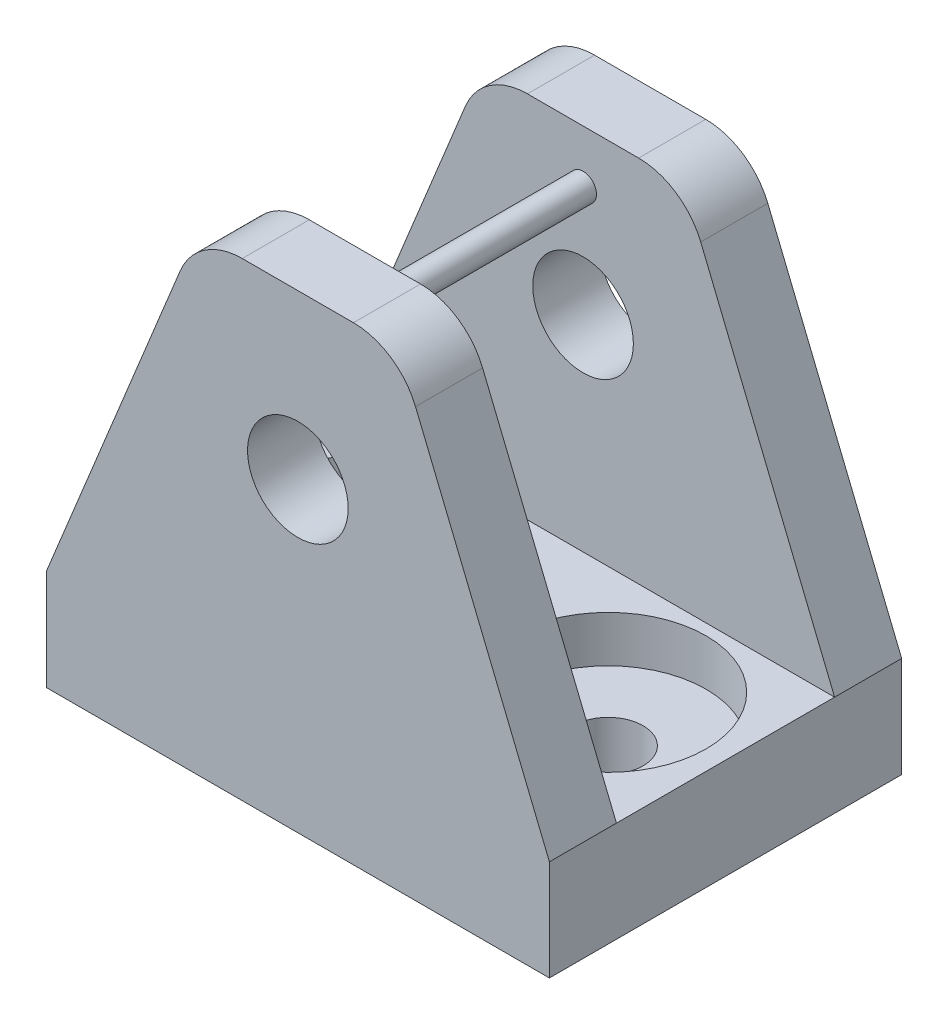
ISO-10303-21;
HEADER;
FILE_DESCRIPTION(('STEP AP214'),'2;1');
FILE_NAME('part.step','',(''),(''),'','','');
FILE_SCHEMA(('AUTOMOTIVE_DESIGN { 1 0 10303 214 1 1 1 1 }'));
ENDSEC;
DATA;
#1=APPLICATION_CONTEXT('core data for automotive mechanical design processes');
#2=APPLICATION_PROTOCOL_DEFINITION('international standard','automotive_design',2000,#1);
#3=PRODUCT_CONTEXT('',#1,'mechanical');
#4=PRODUCT('Part','Part','',(#3));
#5=PRODUCT_RELATED_PRODUCT_CATEGORY('part','',(#4));
#6=PRODUCT_DEFINITION_FORMATION('','',#4);
#7=PRODUCT_DEFINITION_CONTEXT('part definition',#1,'design');
#8=PRODUCT_DEFINITION('design','',#6,#7);
#9=PRODUCT_DEFINITION_SHAPE('','',#8);
#10=(LENGTH_UNIT() NAMED_UNIT(*) SI_UNIT(.MILLI.,.METRE.));
#11=(NAMED_UNIT(*) PLANE_ANGLE_UNIT() SI_UNIT($,.RADIAN.));
#12=(NAMED_UNIT(*) SI_UNIT($,.STERADIAN.) SOLID_ANGLE_UNIT());
#13=UNCERTAINTY_MEASURE_WITH_UNIT(LENGTH_MEASURE(1.E-05),#10,'distance_accuracy_value','');
#14=(GEOMETRIC_REPRESENTATION_CONTEXT(3) GLOBAL_UNCERTAINTY_ASSIGNED_CONTEXT((#13)) GLOBAL_UNIT_ASSIGNED_CONTEXT((#10,
#11,#12)) REPRESENTATION_CONTEXT('',''));
#15=CARTESIAN_POINT('',(0.,0.,0.));
#16=DIRECTION('',(0.,0.,1.));
#17=DIRECTION('',(1.,0.,0.));
#18=AXIS2_PLACEMENT_3D('',#15,#16,#17);
#19=CARTESIAN_POINT('',(0.,44.45,0.));
#20=DIRECTION('',(0.,-1.,0.));
#21=DIRECTION('',(0.,0.,-1.));
#22=AXIS2_PLACEMENT_3D('',#19,#20,#21);
#23=PLANE('',#22);
#24=DIRECTION('',(-1.,0.,0.));
#25=VECTOR('',#24,1.);
#26=CARTESIAN_POINT('',(-23.8125,44.45,-10.3251));
#27=LINE('',#26,#25);
#28=CARTESIAN_POINT('',(5.26191923114274,44.45,-10.3251));
#29=VERTEX_POINT('',#28);
#30=CARTESIAN_POINT('',(-5.26191923114273,44.45,-10.3251));
#31=VERTEX_POINT('',#30);
#32=EDGE_CURVE('E257',#29,#31,#27,.T.);
#33=ORIENTED_EDGE('',*,*,#32,.F.);
#34=DIRECTION('',(0.,0.,-1.));
#35=VECTOR('',#34,1.);
#36=CARTESIAN_POINT('',(5.26191923114274,44.45,0.));
#37=LINE('',#36,#35);
#38=CARTESIAN_POINT('',(5.26191923114274,44.45,-16.6751));
#39=VERTEX_POINT('',#38);
#40=EDGE_CURVE('E248',#29,#39,#37,.T.);
#41=ORIENTED_EDGE('',*,*,#40,.T.);
#42=DIRECTION('',(-1.,0.,0.));
#43=VECTOR('',#42,1.);
#44=CARTESIAN_POINT('',(-23.8125,44.45,-16.6751));
#45=LINE('',#44,#43);
#46=CARTESIAN_POINT('',(-5.26191923114273,44.45,-16.6751));
#47=VERTEX_POINT('',#46);
#48=EDGE_CURVE('E298',#39,#47,#45,.T.);
#49=ORIENTED_EDGE('',*,*,#48,.T.);
#50=DIRECTION('',(0.,0.,-1.));
#51=VECTOR('',#50,1.);
#52=CARTESIAN_POINT('',(-5.26191923114273,44.45,-10.3251));
#53=LINE('',#52,#51);
#54=EDGE_CURVE('E245',#47,#31,#53,.F.);
#55=ORIENTED_EDGE('',*,*,#54,.T.);
#56=EDGE_LOOP('',(#33,#41,#49,#55));
#57=FACE_BOUND('',#56,.T.);
#58=ADVANCED_FACE('F50',(#57),#23,.F.);
#59=CARTESIAN_POINT('',(-23.8125,44.45,-16.6751));
#60=DIRECTION('',(0.,0.,1.));
#61=DIRECTION('',(1.,0.,0.));
#62=AXIS2_PLACEMENT_3D('',#59,#60,#61);
#63=PLANE('',#62);
#64=CARTESIAN_POINT('',(0.,28.9694674268048,-16.6751));
#65=DIRECTION('',(0.,0.,1.));
#66=DIRECTION('',(1.,0.,0.));
#67=AXIS2_PLACEMENT_3D('',#64,#65,#66);
#68=CIRCLE('',#67,4.76249999999999);
#69=CARTESIAN_POINT('',(4.76249999999999,28.9694674268048,-16.6751));
#70=VERTEX_POINT('',#69);
#71=EDGE_CURVE('E749',#70,#70,#68,.T.);
#72=ORIENTED_EDGE('',*,*,#71,.T.);
#73=EDGE_LOOP('',(#72));
#74=FACE_BOUND('',#73,.T.);
#75=ORIENTED_EDGE('',*,*,#48,.F.);
#76=CARTESIAN_POINT('',(5.26191923114274,38.1,-16.6751));
#77=DIRECTION('',(0.,0.,1.));
#78=DIRECTION('',(1.,0.,0.));
#79=AXIS2_PLACEMENT_3D('',#76,#77,#78);
#80=CIRCLE('',#79,6.35);
#81=CARTESIAN_POINT('',(11.1391424030488,40.5043185703252,-16.6751));
#82=VERTEX_POINT('',#81);
#83=EDGE_CURVE('E376',#39,#82,#80,.F.);
#84=ORIENTED_EDGE('',*,*,#83,.T.);
#85=DIRECTION('',(0.378632845720504,-0.925546956205677,0.));
#86=VECTOR('',#85,1.);
#87=CARTESIAN_POINT('',(4.74564159292036,56.1328761061947,-16.6751));
#88=LINE('',#87,#86);
#89=CARTESIAN_POINT('',(23.8125,9.525,-16.6751));
#90=VERTEX_POINT('',#89);
#91=EDGE_CURVE('E259',#82,#90,#88,.T.);
#92=ORIENTED_EDGE('',*,*,#91,.T.);
#93=DIRECTION('',(0.,-1.,0.));
#94=VECTOR('',#93,1.);
#95=CARTESIAN_POINT('',(23.8125,44.45,-16.6751));
#96=LINE('',#95,#94);
#97=CARTESIAN_POINT('',(23.8125,0.,-16.6751));
#98=VERTEX_POINT('',#97);
#99=EDGE_CURVE('E194',#90,#98,#96,.T.);
#100=ORIENTED_EDGE('',*,*,#99,.T.);
#101=DIRECTION('',(-1.,0.,0.));
#102=VECTOR('',#101,1.);
#103=CARTESIAN_POINT('',(-23.8125,0.,-16.6751));
#104=LINE('',#103,#102);
#105=CARTESIAN_POINT('',(-23.8125,0.,-16.6751));
#106=VERTEX_POINT('',#105);
#107=EDGE_CURVE('E341',#98,#106,#104,.T.);
#108=ORIENTED_EDGE('',*,*,#107,.T.);
#109=DIRECTION('',(0.,-1.,0.));
#110=VECTOR('',#109,1.);
#111=CARTESIAN_POINT('',(-23.8125,44.45,-16.6751));
#112=LINE('',#111,#110);
#113=CARTESIAN_POINT('',(-23.8125,9.525,-16.6751));
#114=VERTEX_POINT('',#113);
#115=EDGE_CURVE('E189',#114,#106,#112,.T.);
#116=ORIENTED_EDGE('',*,*,#115,.F.);
#117=DIRECTION('',(-0.378632845720504,-0.925546956205677,0.));
#118=VECTOR('',#117,1.);
#119=CARTESIAN_POINT('',(-11.573296460177,39.4430530973451,-16.6751));
#120=LINE('',#119,#118);
#121=CARTESIAN_POINT('',(-11.1391424030488,40.5043185703252,-16.6751));
#122=VERTEX_POINT('',#121);
#123=EDGE_CURVE('E253',#122,#114,#120,.T.);
#124=ORIENTED_EDGE('',*,*,#123,.F.);
#125=CARTESIAN_POINT('',(-5.26191923114273,38.1,-16.6751));
#126=DIRECTION('',(0.,0.,1.));
#127=DIRECTION('',(1.,0.,0.));
#128=AXIS2_PLACEMENT_3D('',#125,#126,#127);
#129=CIRCLE('',#128,6.35);
#130=EDGE_CURVE('E252',#122,#47,#129,.F.);
#131=ORIENTED_EDGE('',*,*,#130,.T.);
#132=EDGE_LOOP('',(#75,#84,#92,#100,#108,#116,#124,#131));
#133=FACE_BOUND('',#132,.T.);
#134=ADVANCED_FACE('F339',(#74,#133),#63,.F.);
#135=CARTESIAN_POINT('',(-23.8125,44.45,16.6751));
#136=DIRECTION('',(1.,0.,0.));
#137=DIRECTION('',(0.,0.,-1.));
#138=AXIS2_PLACEMENT_3D('',#135,#136,#137);
#139=PLANE('',#138);
#140=DIRECTION('',(0.,0.,-1.));
#141=VECTOR('',#140,1.);
#142=CARTESIAN_POINT('',(-23.8125,9.525,16.6751));
#143=LINE('',#142,#141);
#144=CARTESIAN_POINT('',(-23.8125,9.525,-10.3251));
#145=VERTEX_POINT('',#144);
#146=EDGE_CURVE('E169',#145,#114,#143,.T.);
#147=ORIENTED_EDGE('',*,*,#146,.T.);
#148=ORIENTED_EDGE('',*,*,#115,.T.);
#149=DIRECTION('',(0.,0.,1.));
#150=VECTOR('',#149,1.);
#151=CARTESIAN_POINT('',(-23.8125,0.,16.6751));
#152=LINE('',#151,#150);
#153=CARTESIAN_POINT('',(-23.8125,0.,16.6751));
#154=VERTEX_POINT('',#153);
#155=EDGE_CURVE('E186',#106,#154,#152,.T.);
#156=ORIENTED_EDGE('',*,*,#155,.T.);
#157=DIRECTION('',(0.,-1.,0.));
#158=VECTOR('',#157,1.);
#159=CARTESIAN_POINT('',(-23.8125,44.45,16.6751));
#160=LINE('',#159,#158);
#161=CARTESIAN_POINT('',(-23.8125,9.525,16.6751));
#162=VERTEX_POINT('',#161);
#163=EDGE_CURVE('E175',#162,#154,#160,.T.);
#164=ORIENTED_EDGE('',*,*,#163,.F.);
#165=CARTESIAN_POINT('',(-23.8125,9.525,10.3251));
#166=VERTEX_POINT('',#165);
#167=EDGE_CURVE('E155',#162,#166,#143,.T.);
#168=ORIENTED_EDGE('',*,*,#167,.T.);
#169=DIRECTION('',(0.,0.,1.));
#170=VECTOR('',#169,1.);
#171=CARTESIAN_POINT('',(-23.8125,9.525,10.3251));
#172=LINE('',#171,#170);
#173=EDGE_CURVE('E293',#145,#166,#172,.T.);
#174=ORIENTED_EDGE('',*,*,#173,.F.);
#175=EDGE_LOOP('',(#147,#148,#156,#164,#168,#174));
#176=FACE_BOUND('',#175,.T.);
#177=ADVANCED_FACE('F184',(#176),#139,.F.);
#178=CARTESIAN_POINT('',(-23.8125,44.45,16.6751));
#179=DIRECTION('',(0.,0.,-1.));
#180=DIRECTION('',(-1.,0.,0.));
#181=AXIS2_PLACEMENT_3D('',#178,#179,#180);
#182=PLANE('',#181);
#183=CARTESIAN_POINT('',(0.,28.9694674268048,16.6751));
#184=DIRECTION('',(0.,0.,1.));
#185=DIRECTION('',(1.,0.,0.));
#186=AXIS2_PLACEMENT_3D('',#183,#184,#185);
#187=CIRCLE('',#186,4.76249999999999);
#188=CARTESIAN_POINT('',(4.76249999999999,28.9694674268048,16.6751));
#189=VERTEX_POINT('',#188);
#190=EDGE_CURVE('E757',#189,#189,#187,.T.);
#191=ORIENTED_EDGE('',*,*,#190,.F.);
#192=EDGE_LOOP('',(#191));
#193=FACE_BOUND('',#192,.T.);
#194=DIRECTION('',(-0.378632845720504,0.925546956205677,0.));
#195=VECTOR('',#194,1.);
#196=CARTESIAN_POINT('',(23.7366371681416,9.71044247787611,16.6751));
#197=LINE('',#196,#195);
#198=CARTESIAN_POINT('',(23.8125,9.525,16.6751));
#199=VERTEX_POINT('',#198);
#200=CARTESIAN_POINT('',(11.1391424030488,40.5043185703252,16.6751));
#201=VERTEX_POINT('',#200);
#202=EDGE_CURVE('E213',#199,#201,#197,.T.);
#203=ORIENTED_EDGE('',*,*,#202,.T.);
#204=CARTESIAN_POINT('',(5.26191923114274,38.1,16.6751));
#205=DIRECTION('',(0.,0.,-1.));
#206=DIRECTION('',(-1.,0.,0.));
#207=AXIS2_PLACEMENT_3D('',#204,#205,#206);
#208=CIRCLE('',#207,6.35);
#209=CARTESIAN_POINT('',(5.26191923114274,44.45,16.6751));
#210=VERTEX_POINT('',#209);
#211=EDGE_CURVE('E239',#201,#210,#208,.F.);
#212=ORIENTED_EDGE('',*,*,#211,.T.);
#213=DIRECTION('',(1.,0.,0.));
#214=VECTOR('',#213,1.);
#215=CARTESIAN_POINT('',(-23.8125,44.45,16.6751));
#216=LINE('',#215,#214);
#217=CARTESIAN_POINT('',(-5.26191923114273,44.45,16.6751));
#218=VERTEX_POINT('',#217);
#219=EDGE_CURVE('E196',#218,#210,#216,.T.);
#220=ORIENTED_EDGE('',*,*,#219,.F.);
#221=CARTESIAN_POINT('',(-5.26191923114273,38.1,16.6751));
#222=DIRECTION('',(0.,0.,-1.));
#223=DIRECTION('',(-1.,0.,0.));
#224=AXIS2_PLACEMENT_3D('',#221,#222,#223);
#225=CIRCLE('',#224,6.35);
#226=CARTESIAN_POINT('',(-11.1391424030488,40.5043185703252,16.6751));
#227=VERTEX_POINT('',#226);
#228=EDGE_CURVE('E179',#218,#227,#225,.F.);
#229=ORIENTED_EDGE('',*,*,#228,.T.);
#230=DIRECTION('',(0.378632845720504,0.925546956205677,0.));
#231=VECTOR('',#230,1.);
#232=CARTESIAN_POINT('',(-23.7366371681416,9.71044247787611,16.6751));
#233=LINE('',#232,#231);
#234=EDGE_CURVE('E159',#162,#227,#233,.T.);
#235=ORIENTED_EDGE('',*,*,#234,.F.);
#236=ORIENTED_EDGE('',*,*,#163,.T.);
#237=DIRECTION('',(1.,0.,0.));
#238=VECTOR('',#237,1.);
#239=CARTESIAN_POINT('',(-23.8125,0.,16.6751));
#240=LINE('',#239,#238);
#241=CARTESIAN_POINT('',(23.8125,0.,16.6751));
#242=VERTEX_POINT('',#241);
#243=EDGE_CURVE('E348',#154,#242,#240,.T.);
#244=ORIENTED_EDGE('',*,*,#243,.T.);
#245=DIRECTION('',(0.,-1.,0.));
#246=VECTOR('',#245,1.);
#247=CARTESIAN_POINT('',(23.8125,44.45,16.6751));
#248=LINE('',#247,#246);
#249=EDGE_CURVE('E190',#199,#242,#248,.T.);
#250=ORIENTED_EDGE('',*,*,#249,.F.);
#251=EDGE_LOOP('',(#203,#212,#220,#229,#235,#236,#244,#250));
#252=FACE_BOUND('',#251,.T.);
#253=ADVANCED_FACE('F173',(#193,#252),#182,.F.);
#254=ORIENTED_EDGE('',*,*,#219,.T.);
#255=DIRECTION('',(0.,0.,-1.));
#256=VECTOR('',#255,1.);
#257=CARTESIAN_POINT('',(5.26191923114274,44.45,0.));
#258=LINE('',#257,#256);
#259=CARTESIAN_POINT('',(5.26191923114274,44.45,10.3251));
#260=VERTEX_POINT('',#259);
#261=EDGE_CURVE('E224',#210,#260,#258,.T.);
#262=ORIENTED_EDGE('',*,*,#261,.T.);
#263=DIRECTION('',(1.,0.,0.));
#264=VECTOR('',#263,1.);
#265=CARTESIAN_POINT('',(-23.8125,44.45,10.3251));
#266=LINE('',#265,#264);
#267=CARTESIAN_POINT('',(-5.26191923114273,44.45,10.3251));
#268=VERTEX_POINT('',#267);
#269=EDGE_CURVE('E267',#268,#260,#266,.T.);
#270=ORIENTED_EDGE('',*,*,#269,.F.);
#271=DIRECTION('',(0.,0.,-1.));
#272=VECTOR('',#271,1.);
#273=CARTESIAN_POINT('',(-5.26191923114273,44.45,16.6751));
#274=LINE('',#273,#272);
#275=EDGE_CURVE('E221',#268,#218,#274,.F.);
#276=ORIENTED_EDGE('',*,*,#275,.T.);
#277=EDGE_LOOP('',(#254,#262,#270,#276));
#278=FACE_BOUND('',#277,.T.);
#279=ADVANCED_FACE('F361',(#278),#23,.F.);
#280=CARTESIAN_POINT('',(-23.8125,-51.9092610719899,-10.3251));
#281=DIRECTION('',(0.,0.,-1.));
#282=DIRECTION('',(-1.,0.,0.));
#283=AXIS2_PLACEMENT_3D('',#280,#281,#282);
#284=PLANE('',#283);
#285=CARTESIAN_POINT('',(0.,39.4682751568496,-10.3251));
#286=DIRECTION('',(0.,0.,-1.));
#287=DIRECTION('',(-1.,0.,0.));
#288=AXIS2_PLACEMENT_3D('',#285,#286,#287);
#289=CIRCLE('',#288,1.27);
#290=CARTESIAN_POINT('',(-1.27,39.4682751568496,-10.3251));
#291=VERTEX_POINT('',#290);
#292=EDGE_CURVE('E13',#291,#291,#289,.F.);
#293=ORIENTED_EDGE('',*,*,#292,.F.);
#294=EDGE_LOOP('',(#293));
#295=FACE_BOUND('',#294,.T.);
#296=CARTESIAN_POINT('',(0.,28.9694674268048,-10.3251));
#297=DIRECTION('',(0.,0.,-1.));
#298=DIRECTION('',(-1.,0.,0.));
#299=AXIS2_PLACEMENT_3D('',#296,#297,#298);
#300=CIRCLE('',#299,4.76249999999999);
#301=CARTESIAN_POINT('',(-4.76249999999999,28.9694674268048,-10.3251));
#302=VERTEX_POINT('',#301);
#303=EDGE_CURVE('E747',#302,#302,#300,.T.);
#304=ORIENTED_EDGE('',*,*,#303,.T.);
#305=EDGE_LOOP('',(#304));
#306=FACE_BOUND('',#305,.T.);
#307=DIRECTION('',(-0.378632845720504,0.925546956205677,0.));
#308=VECTOR('',#307,1.);
#309=CARTESIAN_POINT('',(38.5140198092991,-26.4120484227311,-10.3251));
#310=LINE('',#309,#308);
#311=CARTESIAN_POINT('',(23.8125,9.525,-10.3251));
#312=VERTEX_POINT('',#311);
#313=CARTESIAN_POINT('',(11.1391424030488,40.5043185703252,-10.3251));
#314=VERTEX_POINT('',#313);
#315=EDGE_CURVE('E168',#312,#314,#310,.T.);
#316=ORIENTED_EDGE('',*,*,#315,.T.);
#317=CARTESIAN_POINT('',(5.26191923114274,38.1,-10.3251));
#318=DIRECTION('',(0.,0.,-1.));
#319=DIRECTION('',(-1.,0.,0.));
#320=AXIS2_PLACEMENT_3D('',#317,#318,#319);
#321=CIRCLE('',#320,6.35);
#322=EDGE_CURVE('E382',#314,#29,#321,.F.);
#323=ORIENTED_EDGE('',*,*,#322,.T.);
#324=ORIENTED_EDGE('',*,*,#32,.T.);
#325=CARTESIAN_POINT('',(-5.26191923114273,38.1,-10.3251));
#326=DIRECTION('',(0.,0.,-1.));
#327=DIRECTION('',(-1.,0.,0.));
#328=AXIS2_PLACEMENT_3D('',#325,#326,#327);
#329=CIRCLE('',#328,6.35);
#330=CARTESIAN_POINT('',(-11.1391424030488,40.5043185703252,-10.3251));
#331=VERTEX_POINT('',#330);
#332=EDGE_CURVE('E66',#31,#331,#329,.F.);
#333=ORIENTED_EDGE('',*,*,#332,.T.);
#334=DIRECTION('',(0.378632845720504,0.925546956205677,0.));
#335=VECTOR('',#334,1.);
#336=CARTESIAN_POINT('',(-45.3416746765557,-43.1018714315807,-10.3251));
#337=LINE('',#336,#335);
#338=EDGE_CURVE('E258',#145,#331,#337,.T.);
#339=ORIENTED_EDGE('',*,*,#338,.F.);
#340=DIRECTION('',(-1.,0.,0.));
#341=VECTOR('',#340,1.);
#342=CARTESIAN_POINT('',(-23.8125,9.525,-10.3251));
#343=LINE('',#342,#341);
#344=EDGE_CURVE('E272',#312,#145,#343,.T.);
#345=ORIENTED_EDGE('',*,*,#344,.F.);
#346=EDGE_LOOP('',(#316,#323,#324,#333,#339,#345));
#347=FACE_BOUND('',#346,.T.);
#348=ADVANCED_FACE('F402',(#295,#306,#347),#284,.F.);
#349=CARTESIAN_POINT('',(-23.8125,-51.9092610719899,10.3251));
#350=DIRECTION('',(0.,0.,1.));
#351=DIRECTION('',(1.,0.,0.));
#352=AXIS2_PLACEMENT_3D('',#349,#350,#351);
#353=PLANE('',#352);
#354=CARTESIAN_POINT('',(0.,39.4682751568496,10.3251));
#355=DIRECTION('',(0.,0.,1.));
#356=DIRECTION('',(1.,0.,0.));
#357=AXIS2_PLACEMENT_3D('',#354,#355,#356);
#358=CIRCLE('',#357,1.27);
#359=CARTESIAN_POINT('',(1.27,39.4682751568496,10.3251));
#360=VERTEX_POINT('',#359);
#361=EDGE_CURVE('E59',#360,#360,#358,.F.);
#362=ORIENTED_EDGE('',*,*,#361,.F.);
#363=EDGE_LOOP('',(#362));
#364=FACE_BOUND('',#363,.T.);
#365=CARTESIAN_POINT('',(0.,28.9694674268048,10.3251));
#366=DIRECTION('',(0.,0.,1.));
#367=DIRECTION('',(1.,0.,0.));
#368=AXIS2_PLACEMENT_3D('',#365,#366,#367);
#369=CIRCLE('',#368,4.76249999999999);
#370=CARTESIAN_POINT('',(4.76249999999999,28.9694674268048,10.3251));
#371=VERTEX_POINT('',#370);
#372=EDGE_CURVE('E750',#371,#371,#369,.T.);
#373=ORIENTED_EDGE('',*,*,#372,.T.);
#374=EDGE_LOOP('',(#373));
#375=FACE_BOUND('',#374,.T.);
#376=ORIENTED_EDGE('',*,*,#269,.T.);
#377=CARTESIAN_POINT('',(5.26191923114274,38.1,10.3251));
#378=DIRECTION('',(0.,0.,1.));
#379=DIRECTION('',(1.,0.,0.));
#380=AXIS2_PLACEMENT_3D('',#377,#378,#379);
#381=CIRCLE('',#380,6.35);
#382=CARTESIAN_POINT('',(11.1391424030488,40.5043185703252,10.3251));
#383=VERTEX_POINT('',#382);
#384=EDGE_CURVE('E231',#260,#383,#381,.F.);
#385=ORIENTED_EDGE('',*,*,#384,.T.);
#386=DIRECTION('',(0.378632845720504,-0.925546956205677,0.));
#387=VECTOR('',#386,1.);
#388=CARTESIAN_POINT('',(38.5140198092991,-26.4120484227311,10.3251));
#389=LINE('',#388,#387);
#390=CARTESIAN_POINT('',(23.8125,9.525,10.3251));
#391=VERTEX_POINT('',#390);
#392=EDGE_CURVE('E208',#383,#391,#389,.T.);
#393=ORIENTED_EDGE('',*,*,#392,.T.);
#394=DIRECTION('',(1.,0.,0.));
#395=VECTOR('',#394,1.);
#396=CARTESIAN_POINT('',(-23.8125,9.525,10.3251));
#397=LINE('',#396,#395);
#398=EDGE_CURVE('E287',#166,#391,#397,.T.);
#399=ORIENTED_EDGE('',*,*,#398,.F.);
#400=DIRECTION('',(-0.378632845720504,-0.925546956205677,0.));
#401=VECTOR('',#400,1.);
#402=CARTESIAN_POINT('',(-45.3416746765557,-43.1018714315807,10.3251));
#403=LINE('',#402,#401);
#404=CARTESIAN_POINT('',(-11.1391424030488,40.5043185703252,10.3251));
#405=VERTEX_POINT('',#404);
#406=EDGE_CURVE('E162',#405,#166,#403,.T.);
#407=ORIENTED_EDGE('',*,*,#406,.F.);
#408=CARTESIAN_POINT('',(-5.26191923114273,38.1,10.3251));
#409=DIRECTION('',(0.,0.,1.));
#410=DIRECTION('',(1.,0.,0.));
#411=AXIS2_PLACEMENT_3D('',#408,#409,#410);
#412=CIRCLE('',#411,6.35);
#413=EDGE_CURVE('E228',#405,#268,#412,.F.);
#414=ORIENTED_EDGE('',*,*,#413,.T.);
#415=EDGE_LOOP('',(#376,#385,#393,#399,#407,#414));
#416=FACE_BOUND('',#415,.T.);
#417=ADVANCED_FACE('F369',(#364,#375,#416),#353,.F.);
#418=CARTESIAN_POINT('',(23.8125,44.45,16.6751));
#419=DIRECTION('',(-1.,0.,0.));
#420=DIRECTION('',(0.,0.,1.));
#421=AXIS2_PLACEMENT_3D('',#418,#419,#420);
#422=PLANE('',#421);
#423=ORIENTED_EDGE('',*,*,#99,.F.);
#424=DIRECTION('',(0.,0.,-1.));
#425=VECTOR('',#424,1.);
#426=CARTESIAN_POINT('',(23.8125,9.525,16.6751));
#427=LINE('',#426,#425);
#428=EDGE_CURVE('E307',#312,#90,#427,.T.);
#429=ORIENTED_EDGE('',*,*,#428,.F.);
#430=DIRECTION('',(0.,0.,-1.));
#431=VECTOR('',#430,1.);
#432=CARTESIAN_POINT('',(23.8125,9.525,10.3251));
#433=LINE('',#432,#431);
#434=EDGE_CURVE('E282',#391,#312,#433,.T.);
#435=ORIENTED_EDGE('',*,*,#434,.F.);
#436=EDGE_CURVE('E181',#199,#391,#427,.T.);
#437=ORIENTED_EDGE('',*,*,#436,.F.);
#438=ORIENTED_EDGE('',*,*,#249,.T.);
#439=DIRECTION('',(0.,0.,-1.));
#440=VECTOR('',#439,1.);
#441=CARTESIAN_POINT('',(23.8125,0.,16.6751));
#442=LINE('',#441,#440);
#443=EDGE_CURVE('E286',#242,#98,#442,.T.);
#444=ORIENTED_EDGE('',*,*,#443,.T.);
#445=EDGE_LOOP('',(#423,#429,#435,#437,#438,#444));
#446=FACE_BOUND('',#445,.T.);
#447=ADVANCED_FACE('F333',(#446),#422,.F.);
#448=CARTESIAN_POINT('',(0.,0.,0.));
#449=DIRECTION('',(0.,-1.,0.));
#450=DIRECTION('',(0.,0.,-1.));
#451=AXIS2_PLACEMENT_3D('',#448,#449,#450);
#452=PLANE('',#451);
#453=CARTESIAN_POINT('',(-12.7,0.,0.));
#454=DIRECTION('',(0.,-1.,0.));
#455=DIRECTION('',(0.,0.,-1.));
#456=AXIS2_PLACEMENT_3D('',#453,#454,#455);
#457=CIRCLE('',#456,3.3);
#458=CARTESIAN_POINT('',(-12.7,0.,-3.3));
#459=VERTEX_POINT('',#458);
#460=EDGE_CURVE('E215',#459,#459,#457,.T.);
#461=ORIENTED_EDGE('',*,*,#460,.F.);
#462=EDGE_LOOP('',(#461));
#463=FACE_BOUND('',#462,.T.);
#464=CARTESIAN_POINT('',(12.7,0.,0.));
#465=DIRECTION('',(0.,-1.,0.));
#466=DIRECTION('',(0.,0.,-1.));
#467=AXIS2_PLACEMENT_3D('',#464,#465,#466);
#468=CIRCLE('',#467,3.3);
#469=CARTESIAN_POINT('',(12.7,0.,-3.3));
#470=VERTEX_POINT('',#469);
#471=EDGE_CURVE('E209',#470,#470,#468,.T.);
#472=ORIENTED_EDGE('',*,*,#471,.F.);
#473=EDGE_LOOP('',(#472));
#474=FACE_BOUND('',#473,.T.);
#475=ORIENTED_EDGE('',*,*,#443,.F.);
#476=ORIENTED_EDGE('',*,*,#243,.F.);
#477=ORIENTED_EDGE('',*,*,#155,.F.);
#478=ORIENTED_EDGE('',*,*,#107,.F.);
#479=EDGE_LOOP('',(#475,#476,#477,#478));
#480=FACE_BOUND('',#479,.T.);
#481=ADVANCED_FACE('F343',(#463,#474,#480),#452,.T.);
#482=CARTESIAN_POINT('',(0.,9.525,0.));
#483=DIRECTION('',(0.,-1.,0.));
#484=DIRECTION('',(0.,0.,-1.));
#485=AXIS2_PLACEMENT_3D('',#482,#483,#484);
#486=PLANE('',#485);
#487=CARTESIAN_POINT('',(-12.7,9.525,0.));
#488=DIRECTION('',(0.,1.,0.));
#489=DIRECTION('',(0.,0.,1.));
#490=AXIS2_PLACEMENT_3D('',#487,#488,#489);
#491=CIRCLE('',#490,9.275);
#492=CARTESIAN_POINT('',(-12.7,9.525,9.275));
#493=VERTEX_POINT('',#492);
#494=EDGE_CURVE('E471',#493,#493,#491,.T.);
#495=ORIENTED_EDGE('',*,*,#494,.F.);
#496=EDGE_LOOP('',(#495));
#497=FACE_BOUND('',#496,.T.);
#498=CARTESIAN_POINT('',(12.7,9.525,0.));
#499=DIRECTION('',(0.,1.,0.));
#500=DIRECTION('',(0.,0.,1.));
#501=AXIS2_PLACEMENT_3D('',#498,#499,#500);
#502=CIRCLE('',#501,9.275);
#503=CARTESIAN_POINT('',(12.7,9.525,9.275));
#504=VERTEX_POINT('',#503);
#505=EDGE_CURVE('E219',#504,#504,#502,.T.);
#506=ORIENTED_EDGE('',*,*,#505,.F.);
#507=EDGE_LOOP('',(#506));
#508=FACE_BOUND('',#507,.T.);
#509=ORIENTED_EDGE('',*,*,#434,.T.);
#510=ORIENTED_EDGE('',*,*,#344,.T.);
#511=ORIENTED_EDGE('',*,*,#173,.T.);
#512=ORIENTED_EDGE('',*,*,#398,.T.);
#513=EDGE_LOOP('',(#509,#510,#511,#512));
#514=FACE_BOUND('',#513,.T.);
#515=ADVANCED_FACE('F412',(#497,#508,#514),#486,.F.);
#516=CARTESIAN_POINT('',(23.7366371681416,9.71044247787611,16.6751));
#517=DIRECTION('',(-0.925546956205677,-0.378632845720504,0.));
#518=DIRECTION('',(0.378632845720504,-0.925546956205677,0.));
#519=AXIS2_PLACEMENT_3D('',#516,#517,#518);
#520=PLANE('',#519);
#521=ORIENTED_EDGE('',*,*,#392,.F.);
#522=DIRECTION('',(0.,0.,-1.));
#523=VECTOR('',#522,1.);
#524=CARTESIAN_POINT('',(11.1391424030488,40.5043185703252,16.6751));
#525=LINE('',#524,#523);
#526=EDGE_CURVE('E234',#383,#201,#525,.F.);
#527=ORIENTED_EDGE('',*,*,#526,.T.);
#528=ORIENTED_EDGE('',*,*,#202,.F.);
#529=ORIENTED_EDGE('',*,*,#436,.T.);
#530=EDGE_LOOP('',(#521,#527,#528,#529));
#531=FACE_BOUND('',#530,.T.);
#532=ADVANCED_FACE('F370',(#531),#520,.F.);
#533=CARTESIAN_POINT('',(-23.7366371681416,9.71044247787611,16.6751));
#534=DIRECTION('',(-0.925546956205677,0.378632845720504,0.));
#535=DIRECTION('',(-0.378632845720504,-0.925546956205677,0.));
#536=AXIS2_PLACEMENT_3D('',#533,#534,#535);
#537=PLANE('',#536);
#538=ORIENTED_EDGE('',*,*,#234,.T.);
#539=DIRECTION('',(0.,0.,-1.));
#540=VECTOR('',#539,1.);
#541=CARTESIAN_POINT('',(-11.1391424030488,40.5043185703252,10.3251));
#542=LINE('',#541,#540);
#543=EDGE_CURVE('E242',#227,#405,#542,.T.);
#544=ORIENTED_EDGE('',*,*,#543,.T.);
#545=ORIENTED_EDGE('',*,*,#406,.T.);
#546=ORIENTED_EDGE('',*,*,#167,.F.);
#547=EDGE_LOOP('',(#538,#544,#545,#546));
#548=FACE_BOUND('',#547,.T.);
#549=ADVANCED_FACE('F157',(#548),#537,.T.);
#550=ORIENTED_EDGE('',*,*,#91,.F.);
#551=DIRECTION('',(0.,0.,-1.));
#552=VECTOR('',#551,1.);
#553=CARTESIAN_POINT('',(11.1391424030488,40.5043185703252,16.6751));
#554=LINE('',#553,#552);
#555=EDGE_CURVE('E74',#82,#314,#554,.F.);
#556=ORIENTED_EDGE('',*,*,#555,.T.);
#557=ORIENTED_EDGE('',*,*,#315,.F.);
#558=ORIENTED_EDGE('',*,*,#428,.T.);
#559=EDGE_LOOP('',(#550,#556,#557,#558));
#560=FACE_BOUND('',#559,.T.);
#561=ADVANCED_FACE('F328',(#560),#520,.F.);
#562=ORIENTED_EDGE('',*,*,#338,.T.);
#563=DIRECTION('',(0.,0.,-1.));
#564=VECTOR('',#563,1.);
#565=CARTESIAN_POINT('',(-11.1391424030488,40.5043185703252,-16.6751));
#566=LINE('',#565,#564);
#567=EDGE_CURVE('E385',#331,#122,#566,.T.);
#568=ORIENTED_EDGE('',*,*,#567,.T.);
#569=ORIENTED_EDGE('',*,*,#123,.T.);
#570=ORIENTED_EDGE('',*,*,#146,.F.);
#571=EDGE_LOOP('',(#562,#568,#569,#570));
#572=FACE_BOUND('',#571,.T.);
#573=ADVANCED_FACE('F409',(#572),#537,.T.);
#574=CARTESIAN_POINT('',(12.7,9.525,0.));
#575=DIRECTION('',(0.,1.,0.));
#576=DIRECTION('',(0.,0.,1.));
#577=AXIS2_PLACEMENT_3D('',#574,#575,#576);
#578=CYLINDRICAL_SURFACE('',#577,3.3);
#579=ORIENTED_EDGE('',*,*,#471,.T.);
#580=EDGE_LOOP('',(#579));
#581=FACE_BOUND('',#580,.T.);
#582=CARTESIAN_POINT('',(12.7,5.145,0.));
#583=DIRECTION('',(0.,1.,0.));
#584=DIRECTION('',(0.,0.,1.));
#585=AXIS2_PLACEMENT_3D('',#582,#583,#584);
#586=CIRCLE('',#585,3.3);
#587=CARTESIAN_POINT('',(12.7,5.145,3.3));
#588=VERTEX_POINT('',#587);
#589=EDGE_CURVE('E214',#588,#588,#586,.T.);
#590=ORIENTED_EDGE('',*,*,#589,.T.);
#591=EDGE_LOOP('',(#590));
#592=FACE_BOUND('',#591,.T.);
#593=ADVANCED_FACE('F488',(#581,#592),#578,.F.);
#594=CARTESIAN_POINT('',(16.,5.145,0.));
#595=DIRECTION('',(0.,-1.,0.));
#596=DIRECTION('',(0.,0.,-1.));
#597=AXIS2_PLACEMENT_3D('',#594,#595,#596);
#598=PLANE('',#597);
#599=ORIENTED_EDGE('',*,*,#589,.F.);
#600=EDGE_LOOP('',(#599));
#601=FACE_BOUND('',#600,.T.);
#602=CARTESIAN_POINT('',(12.7,5.145,0.));
#603=DIRECTION('',(0.,1.,0.));
#604=DIRECTION('',(0.,0.,1.));
#605=AXIS2_PLACEMENT_3D('',#602,#603,#604);
#606=CIRCLE('',#605,9.275);
#607=CARTESIAN_POINT('',(12.7,5.145,9.275));
#608=VERTEX_POINT('',#607);
#609=EDGE_CURVE('E476',#608,#608,#606,.T.);
#610=ORIENTED_EDGE('',*,*,#609,.T.);
#611=EDGE_LOOP('',(#610));
#612=FACE_BOUND('',#611,.T.);
#613=ADVANCED_FACE('F490',(#601,#612),#598,.F.);
#614=CARTESIAN_POINT('',(12.7,9.525,0.));
#615=DIRECTION('',(0.,1.,0.));
#616=DIRECTION('',(0.,0.,1.));
#617=AXIS2_PLACEMENT_3D('',#614,#615,#616);
#618=CYLINDRICAL_SURFACE('',#617,9.275);
#619=ORIENTED_EDGE('',*,*,#609,.F.);
#620=EDGE_LOOP('',(#619));
#621=FACE_BOUND('',#620,.T.);
#622=ORIENTED_EDGE('',*,*,#505,.T.);
#623=EDGE_LOOP('',(#622));
#624=FACE_BOUND('',#623,.T.);
#625=ADVANCED_FACE('F493',(#621,#624),#618,.F.);
#626=CARTESIAN_POINT('',(-12.7,9.525,0.));
#627=DIRECTION('',(0.,1.,0.));
#628=DIRECTION('',(0.,0.,1.));
#629=AXIS2_PLACEMENT_3D('',#626,#627,#628);
#630=CYLINDRICAL_SURFACE('',#629,3.3);
#631=ORIENTED_EDGE('',*,*,#460,.T.);
#632=EDGE_LOOP('',(#631));
#633=FACE_BOUND('',#632,.T.);
#634=CARTESIAN_POINT('',(-12.7,5.145,0.));
#635=DIRECTION('',(0.,1.,0.));
#636=DIRECTION('',(0.,0.,1.));
#637=AXIS2_PLACEMENT_3D('',#634,#635,#636);
#638=CIRCLE('',#637,3.3);
#639=CARTESIAN_POINT('',(-12.7,5.145,3.3));
#640=VERTEX_POINT('',#639);
#641=EDGE_CURVE('E220',#640,#640,#638,.T.);
#642=ORIENTED_EDGE('',*,*,#641,.T.);
#643=EDGE_LOOP('',(#642));
#644=FACE_BOUND('',#643,.T.);
#645=ADVANCED_FACE('F498',(#633,#644),#630,.F.);
#646=CARTESIAN_POINT('',(-9.4,5.145,0.));
#647=DIRECTION('',(0.,-1.,0.));
#648=DIRECTION('',(0.,0.,-1.));
#649=AXIS2_PLACEMENT_3D('',#646,#647,#648);
#650=PLANE('',#649);
#651=ORIENTED_EDGE('',*,*,#641,.F.);
#652=EDGE_LOOP('',(#651));
#653=FACE_BOUND('',#652,.T.);
#654=CARTESIAN_POINT('',(-12.7,5.145,0.));
#655=DIRECTION('',(0.,1.,0.));
#656=DIRECTION('',(0.,0.,1.));
#657=AXIS2_PLACEMENT_3D('',#654,#655,#656);
#658=CIRCLE('',#657,9.275);
#659=CARTESIAN_POINT('',(-12.7,5.145,9.275));
#660=VERTEX_POINT('',#659);
#661=EDGE_CURVE('E762',#660,#660,#658,.T.);
#662=ORIENTED_EDGE('',*,*,#661,.T.);
#663=EDGE_LOOP('',(#662));
#664=FACE_BOUND('',#663,.T.);
#665=ADVANCED_FACE('F503',(#653,#664),#650,.F.);
#666=CARTESIAN_POINT('',(-12.7,9.525,0.));
#667=DIRECTION('',(0.,1.,0.));
#668=DIRECTION('',(0.,0.,1.));
#669=AXIS2_PLACEMENT_3D('',#666,#667,#668);
#670=CYLINDRICAL_SURFACE('',#669,9.275);
#671=ORIENTED_EDGE('',*,*,#661,.F.);
#672=EDGE_LOOP('',(#671));
#673=FACE_BOUND('',#672,.T.);
#674=ORIENTED_EDGE('',*,*,#494,.T.);
#675=EDGE_LOOP('',(#674));
#676=FACE_BOUND('',#675,.T.);
#677=ADVANCED_FACE('F423',(#673,#676),#670,.F.);
#678=CARTESIAN_POINT('',(5.26191923114274,38.1,0.));
#679=DIRECTION('',(0.,0.,-1.));
#680=DIRECTION('',(-1.,0.,0.));
#681=AXIS2_PLACEMENT_3D('',#678,#679,#680);
#682=CYLINDRICAL_SURFACE('',#681,6.35);
#683=ORIENTED_EDGE('',*,*,#211,.F.);
#684=ORIENTED_EDGE('',*,*,#526,.F.);
#685=ORIENTED_EDGE('',*,*,#384,.F.);
#686=ORIENTED_EDGE('',*,*,#261,.F.);
#687=EDGE_LOOP('',(#683,#684,#685,#686));
#688=FACE_BOUND('',#687,.T.);
#689=ADVANCED_FACE('F366',(#688),#682,.T.);
#690=CARTESIAN_POINT('',(-5.26191923114273,38.1,16.6751));
#691=DIRECTION('',(0.,0.,1.));
#692=DIRECTION('',(1.,0.,0.));
#693=AXIS2_PLACEMENT_3D('',#690,#691,#692);
#694=CYLINDRICAL_SURFACE('',#693,6.35);
#695=ORIENTED_EDGE('',*,*,#228,.F.);
#696=ORIENTED_EDGE('',*,*,#275,.F.);
#697=ORIENTED_EDGE('',*,*,#413,.F.);
#698=ORIENTED_EDGE('',*,*,#543,.F.);
#699=EDGE_LOOP('',(#695,#696,#697,#698));
#700=FACE_BOUND('',#699,.T.);
#701=ADVANCED_FACE('F414',(#700),#694,.T.);
#702=CARTESIAN_POINT('',(5.26191923114274,38.1,0.));
#703=DIRECTION('',(0.,0.,-1.));
#704=DIRECTION('',(-1.,0.,0.));
#705=AXIS2_PLACEMENT_3D('',#702,#703,#704);
#706=CYLINDRICAL_SURFACE('',#705,6.35);
#707=ORIENTED_EDGE('',*,*,#322,.F.);
#708=ORIENTED_EDGE('',*,*,#555,.F.);
#709=ORIENTED_EDGE('',*,*,#83,.F.);
#710=ORIENTED_EDGE('',*,*,#40,.F.);
#711=EDGE_LOOP('',(#707,#708,#709,#710));
#712=FACE_BOUND('',#711,.T.);
#713=ADVANCED_FACE('F416',(#712),#706,.T.);
#714=CARTESIAN_POINT('',(-5.26191923114273,38.1,16.6751));
#715=DIRECTION('',(0.,0.,1.));
#716=DIRECTION('',(1.,0.,0.));
#717=AXIS2_PLACEMENT_3D('',#714,#715,#716);
#718=CYLINDRICAL_SURFACE('',#717,6.35);
#719=ORIENTED_EDGE('',*,*,#332,.F.);
#720=ORIENTED_EDGE('',*,*,#54,.F.);
#721=ORIENTED_EDGE('',*,*,#130,.F.);
#722=ORIENTED_EDGE('',*,*,#567,.F.);
#723=EDGE_LOOP('',(#719,#720,#721,#722));
#724=FACE_BOUND('',#723,.T.);
#725=ADVANCED_FACE('F52',(#724),#718,.T.);
#726=CARTESIAN_POINT('',(0.,28.9694674268048,16.6751));
#727=DIRECTION('',(0.,0.,1.));
#728=DIRECTION('',(1.,0.,0.));
#729=AXIS2_PLACEMENT_3D('',#726,#727,#728);
#730=CYLINDRICAL_SURFACE('',#729,4.76249999999999);
#731=ORIENTED_EDGE('',*,*,#190,.T.);
#732=EDGE_LOOP('',(#731));
#733=FACE_BOUND('',#732,.T.);
#734=ORIENTED_EDGE('',*,*,#372,.F.);
#735=EDGE_LOOP('',(#734));
#736=FACE_BOUND('',#735,.T.);
#737=ADVANCED_FACE('F582',(#733,#736),#730,.F.);
#738=ORIENTED_EDGE('',*,*,#303,.F.);
#739=EDGE_LOOP('',(#738));
#740=FACE_BOUND('',#739,.T.);
#741=ORIENTED_EDGE('',*,*,#71,.F.);
#742=EDGE_LOOP('',(#741));
#743=FACE_BOUND('',#742,.T.);
#744=ADVANCED_FACE('F589',(#740,#743),#730,.F.);
#745=CARTESIAN_POINT('',(0.,39.4682751568496,16.6771));
#746=DIRECTION('',(0.,0.,-1.));
#747=DIRECTION('',(-1.,0.,0.));
#748=AXIS2_PLACEMENT_3D('',#745,#746,#747);
#749=CYLINDRICAL_SURFACE('',#748,1.27);
#750=ORIENTED_EDGE('',*,*,#292,.T.);
#751=EDGE_LOOP('',(#750));
#752=FACE_BOUND('',#751,.T.);
#753=ORIENTED_EDGE('',*,*,#361,.T.);
#754=EDGE_LOOP('',(#753));
#755=FACE_BOUND('',#754,.T.);
#756=ADVANCED_FACE('F599',(#752,#755),#749,.T.);
#757=CLOSED_SHELL('',(#58,#134,#177,#253,#279,#348,#417,#447,#481,#515,#532,#549,#561,#573,#593,
#613,#625,#645,#665,#677,#689,#701,#713,#725,#737,#744,#756));
#758=MANIFOLD_SOLID_BREP('B2',#757);
#759=ADVANCED_BREP_SHAPE_REPRESENTATION('',(#18,#758),#14);
#760=SHAPE_DEFINITION_REPRESENTATION(#9,#759);
ENDSEC;
END-ISO-10303-21;
